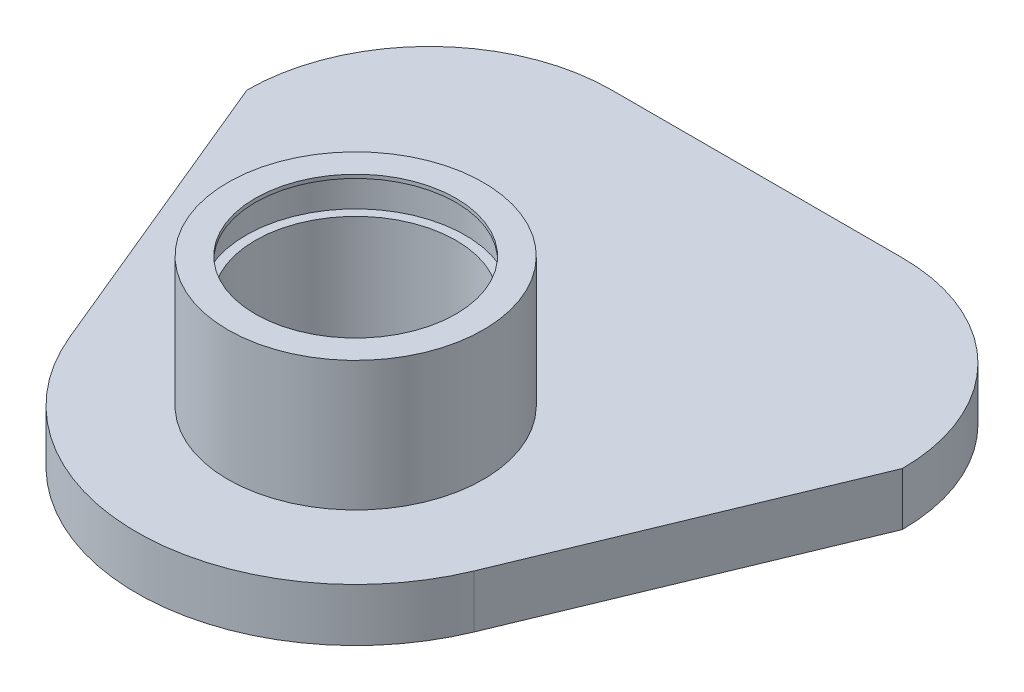
ISO-10303-21;
HEADER;
FILE_DESCRIPTION(('STEP AP214'),'2;1');
FILE_NAME('part.step','',(''),(''),'','','');
FILE_SCHEMA(('AUTOMOTIVE_DESIGN { 1 0 10303 214 1 1 1 1 }'));
ENDSEC;
DATA;
#1=APPLICATION_CONTEXT('core data for automotive mechanical design processes');
#2=APPLICATION_PROTOCOL_DEFINITION('international standard','automotive_design',2000,#1);
#3=PRODUCT_CONTEXT('',#1,'mechanical');
#4=PRODUCT('Part','Part','',(#3));
#5=PRODUCT_RELATED_PRODUCT_CATEGORY('part','',(#4));
#6=PRODUCT_DEFINITION_FORMATION('','',#4);
#7=PRODUCT_DEFINITION_CONTEXT('part definition',#1,'design');
#8=PRODUCT_DEFINITION('design','',#6,#7);
#9=PRODUCT_DEFINITION_SHAPE('','',#8);
#10=(LENGTH_UNIT() NAMED_UNIT(*) SI_UNIT(.MILLI.,.METRE.));
#11=(NAMED_UNIT(*) PLANE_ANGLE_UNIT() SI_UNIT($,.RADIAN.));
#12=(NAMED_UNIT(*) SI_UNIT($,.STERADIAN.) SOLID_ANGLE_UNIT());
#13=UNCERTAINTY_MEASURE_WITH_UNIT(LENGTH_MEASURE(1.E-05),#10,'distance_accuracy_value','');
#14=(GEOMETRIC_REPRESENTATION_CONTEXT(3) GLOBAL_UNCERTAINTY_ASSIGNED_CONTEXT((#13)) GLOBAL_UNIT_ASSIGNED_CONTEXT((#10,
#11,#12)) REPRESENTATION_CONTEXT('',''));
#15=CARTESIAN_POINT('',(0.,0.,0.));
#16=DIRECTION('',(0.,0.,1.));
#17=DIRECTION('',(1.,0.,0.));
#18=AXIS2_PLACEMENT_3D('',#15,#16,#17);
#19=CARTESIAN_POINT('',(0.,2.9,0.));
#20=DIRECTION('',(0.,-1.,0.));
#21=DIRECTION('',(0.,0.,-1.));
#22=AXIS2_PLACEMENT_3D('',#19,#20,#21);
#23=CYLINDRICAL_SURFACE('',#22,12.);
#24=CARTESIAN_POINT('',(0.,0.,0.));
#25=DIRECTION('',(0.,1.,0.));
#26=DIRECTION('',(0.,0.,1.));
#27=AXIS2_PLACEMENT_3D('',#24,#25,#26);
#28=CIRCLE('',#27,12.);
#29=CARTESIAN_POINT('',(-11.0865543901354,0.,4.59220118838109));
#30=VERTEX_POINT('',#29);
#31=CARTESIAN_POINT('',(11.0865543901354,0.,4.59220118838109));
#32=VERTEX_POINT('',#31);
#33=EDGE_CURVE('E135',#30,#32,#28,.T.);
#34=ORIENTED_EDGE('',*,*,#33,.T.);
#35=DIRECTION('',(0.,-1.,0.));
#36=VECTOR('',#35,1.);
#37=CARTESIAN_POINT('',(11.0865543901354,2.9,4.59220118838109));
#38=LINE('',#37,#36);
#39=CARTESIAN_POINT('',(11.0865543901354,2.9,4.59220118838109));
#40=VERTEX_POINT('',#39);
#41=EDGE_CURVE('E11',#40,#32,#38,.T.);
#42=ORIENTED_EDGE('',*,*,#41,.F.);
#43=CARTESIAN_POINT('',(0.,2.9,0.));
#44=DIRECTION('',(0.,1.,0.));
#45=DIRECTION('',(0.,0.,1.));
#46=AXIS2_PLACEMENT_3D('',#43,#44,#45);
#47=CIRCLE('',#46,12.);
#48=CARTESIAN_POINT('',(-11.0865543901354,2.9,4.59220118838109));
#49=VERTEX_POINT('',#48);
#50=EDGE_CURVE('E153',#49,#40,#47,.T.);
#51=ORIENTED_EDGE('',*,*,#50,.F.);
#52=DIRECTION('',(0.,-1.,0.));
#53=VECTOR('',#52,1.);
#54=CARTESIAN_POINT('',(-11.0865543901354,2.9,4.59220118838109));
#55=LINE('',#54,#53);
#56=EDGE_CURVE('E55',#49,#30,#55,.T.);
#57=ORIENTED_EDGE('',*,*,#56,.T.);
#58=EDGE_LOOP('',(#34,#42,#51,#57));
#59=FACE_BOUND('',#58,.T.);
#60=ADVANCED_FACE('F39',(#59),#23,.T.);
#61=CARTESIAN_POINT('',(11.0865543901354,2.9,4.59220118838109));
#62=DIRECTION('',(-0.923879532511286,0.,-0.382683432365091));
#63=DIRECTION('',(-0.382683432365091,0.,0.923879532511287));
#64=AXIS2_PLACEMENT_3D('',#61,#62,#63);
#65=PLANE('',#64);
#66=DIRECTION('',(0.382683432365091,0.,-0.923879532511287));
#67=VECTOR('',#66,1.);
#68=CARTESIAN_POINT('',(11.0865543901354,0.,4.59220118838109));
#69=LINE('',#68,#67);
#70=CARTESIAN_POINT('',(17.9592691519859,0.,-12.));
#71=VERTEX_POINT('',#70);
#72=EDGE_CURVE('E137',#32,#71,#69,.T.);
#73=ORIENTED_EDGE('',*,*,#72,.T.);
#74=DIRECTION('',(0.,-1.,0.));
#75=VECTOR('',#74,1.);
#76=CARTESIAN_POINT('',(17.9592691519859,2.9,-12.));
#77=LINE('',#76,#75);
#78=CARTESIAN_POINT('',(17.9592691519859,2.9,-12.));
#79=VERTEX_POINT('',#78);
#80=EDGE_CURVE('E47',#79,#71,#77,.T.);
#81=ORIENTED_EDGE('',*,*,#80,.F.);
#82=DIRECTION('',(0.382683432365091,0.,-0.923879532511287));
#83=VECTOR('',#82,1.);
#84=CARTESIAN_POINT('',(11.0865543901354,2.9,4.59220118838109));
#85=LINE('',#84,#83);
#86=EDGE_CURVE('E93',#40,#79,#85,.T.);
#87=ORIENTED_EDGE('',*,*,#86,.F.);
#88=ORIENTED_EDGE('',*,*,#41,.T.);
#89=EDGE_LOOP('',(#73,#81,#87,#88));
#90=FACE_BOUND('',#89,.T.);
#91=ADVANCED_FACE('F235',(#90),#65,.F.);
#92=CARTESIAN_POINT('',(17.9592691519859,2.9,0.));
#93=DIRECTION('',(-1.,0.,0.));
#94=DIRECTION('',(0.,0.,1.));
#95=AXIS2_PLACEMENT_3D('',#92,#93,#94);
#96=PLANE('',#95);
#97=DIRECTION('',(0.,0.,-1.));
#98=VECTOR('',#97,1.);
#99=CARTESIAN_POINT('',(17.9592691519859,0.,0.));
#100=LINE('',#99,#98);
#101=CARTESIAN_POINT('',(17.9592691519859,0.,-12.01));
#102=VERTEX_POINT('',#101);
#103=EDGE_CURVE('E140',#71,#102,#100,.T.);
#104=ORIENTED_EDGE('',*,*,#103,.T.);
#105=DIRECTION('',(0.,-1.,0.));
#106=VECTOR('',#105,1.);
#107=CARTESIAN_POINT('',(17.9592691519859,2.9,-12.01));
#108=LINE('',#107,#106);
#109=CARTESIAN_POINT('',(17.9592691519859,2.9,-12.01));
#110=VERTEX_POINT('',#109);
#111=EDGE_CURVE('E160',#110,#102,#108,.T.);
#112=ORIENTED_EDGE('',*,*,#111,.F.);
#113=DIRECTION('',(0.,0.,-1.));
#114=VECTOR('',#113,1.);
#115=CARTESIAN_POINT('',(17.9592691519859,2.9,0.));
#116=LINE('',#115,#114);
#117=EDGE_CURVE('E168',#79,#110,#116,.T.);
#118=ORIENTED_EDGE('',*,*,#117,.F.);
#119=ORIENTED_EDGE('',*,*,#80,.T.);
#120=EDGE_LOOP('',(#104,#112,#118,#119));
#121=FACE_BOUND('',#120,.T.);
#122=ADVANCED_FACE('F166',(#121),#96,.F.);
#123=CARTESIAN_POINT('',(7.96926915198588,2.9,-12.01));
#124=DIRECTION('',(0.,-1.,0.));
#125=DIRECTION('',(0.,0.,-1.));
#126=AXIS2_PLACEMENT_3D('',#123,#124,#125);
#127=CYLINDRICAL_SURFACE('',#126,9.99);
#128=CARTESIAN_POINT('',(7.96926915198588,0.,-12.01));
#129=DIRECTION('',(0.,1.,0.));
#130=DIRECTION('',(0.,0.,1.));
#131=AXIS2_PLACEMENT_3D('',#128,#129,#130);
#132=CIRCLE('',#131,9.99);
#133=CARTESIAN_POINT('',(7.96926915198588,0.,-22.));
#134=VERTEX_POINT('',#133);
#135=EDGE_CURVE('E142',#102,#134,#132,.T.);
#136=ORIENTED_EDGE('',*,*,#135,.T.);
#137=DIRECTION('',(0.,-1.,0.));
#138=VECTOR('',#137,1.);
#139=CARTESIAN_POINT('',(7.96926915198588,2.9,-22.));
#140=LINE('',#139,#138);
#141=CARTESIAN_POINT('',(7.96926915198588,2.9,-22.));
#142=VERTEX_POINT('',#141);
#143=EDGE_CURVE('E157',#142,#134,#140,.T.);
#144=ORIENTED_EDGE('',*,*,#143,.F.);
#145=CARTESIAN_POINT('',(7.96926915198588,2.9,-12.01));
#146=DIRECTION('',(0.,1.,0.));
#147=DIRECTION('',(0.,0.,1.));
#148=AXIS2_PLACEMENT_3D('',#145,#146,#147);
#149=CIRCLE('',#148,9.99);
#150=EDGE_CURVE('E179',#110,#142,#149,.T.);
#151=ORIENTED_EDGE('',*,*,#150,.F.);
#152=ORIENTED_EDGE('',*,*,#111,.T.);
#153=EDGE_LOOP('',(#136,#144,#151,#152));
#154=FACE_BOUND('',#153,.T.);
#155=ADVANCED_FACE('F175',(#154),#127,.T.);
#156=CARTESIAN_POINT('',(0.,2.9,-22.));
#157=DIRECTION('',(0.,0.,1.));
#158=DIRECTION('',(1.,0.,0.));
#159=AXIS2_PLACEMENT_3D('',#156,#157,#158);
#160=PLANE('',#159);
#161=DIRECTION('',(-1.,0.,0.));
#162=VECTOR('',#161,1.);
#163=CARTESIAN_POINT('',(0.,0.,-22.));
#164=LINE('',#163,#162);
#165=CARTESIAN_POINT('',(-7.96926915198588,0.,-22.));
#166=VERTEX_POINT('',#165);
#167=EDGE_CURVE('E144',#134,#166,#164,.T.);
#168=ORIENTED_EDGE('',*,*,#167,.T.);
#169=DIRECTION('',(0.,-1.,0.));
#170=VECTOR('',#169,1.);
#171=CARTESIAN_POINT('',(-7.96926915198588,2.9,-22.));
#172=LINE('',#171,#170);
#173=CARTESIAN_POINT('',(-7.96926915198588,2.9,-22.));
#174=VERTEX_POINT('',#173);
#175=EDGE_CURVE('E118',#174,#166,#172,.T.);
#176=ORIENTED_EDGE('',*,*,#175,.F.);
#177=DIRECTION('',(-1.,0.,0.));
#178=VECTOR('',#177,1.);
#179=CARTESIAN_POINT('',(0.,2.9,-22.));
#180=LINE('',#179,#178);
#181=EDGE_CURVE('E126',#142,#174,#180,.T.);
#182=ORIENTED_EDGE('',*,*,#181,.F.);
#183=ORIENTED_EDGE('',*,*,#143,.T.);
#184=EDGE_LOOP('',(#168,#176,#182,#183));
#185=FACE_BOUND('',#184,.T.);
#186=ADVANCED_FACE('F178',(#185),#160,.F.);
#187=CARTESIAN_POINT('',(-7.96926915198588,2.9,-12.01));
#188=DIRECTION('',(0.,-1.,0.));
#189=DIRECTION('',(0.,0.,-1.));
#190=AXIS2_PLACEMENT_3D('',#187,#188,#189);
#191=CYLINDRICAL_SURFACE('',#190,9.99);
#192=CARTESIAN_POINT('',(-7.96926915198588,0.,-12.01));
#193=DIRECTION('',(0.,1.,0.));
#194=DIRECTION('',(0.,0.,1.));
#195=AXIS2_PLACEMENT_3D('',#192,#193,#194);
#196=CIRCLE('',#195,9.99);
#197=CARTESIAN_POINT('',(-17.9592691519859,0.,-12.01));
#198=VERTEX_POINT('',#197);
#199=EDGE_CURVE('E114',#198,#166,#196,.F.);
#200=ORIENTED_EDGE('',*,*,#199,.F.);
#201=DIRECTION('',(0.,-1.,0.));
#202=VECTOR('',#201,1.);
#203=CARTESIAN_POINT('',(-17.9592691519859,2.9,-12.01));
#204=LINE('',#203,#202);
#205=CARTESIAN_POINT('',(-17.9592691519859,2.9,-12.01));
#206=VERTEX_POINT('',#205);
#207=EDGE_CURVE('E109',#206,#198,#204,.T.);
#208=ORIENTED_EDGE('',*,*,#207,.F.);
#209=CARTESIAN_POINT('',(-7.96926915198588,2.9,-12.01));
#210=DIRECTION('',(0.,1.,0.));
#211=DIRECTION('',(0.,0.,1.));
#212=AXIS2_PLACEMENT_3D('',#209,#210,#211);
#213=CIRCLE('',#212,9.99);
#214=EDGE_CURVE('E112',#206,#174,#213,.F.);
#215=ORIENTED_EDGE('',*,*,#214,.T.);
#216=ORIENTED_EDGE('',*,*,#175,.T.);
#217=EDGE_LOOP('',(#200,#208,#215,#216));
#218=FACE_BOUND('',#217,.T.);
#219=ADVANCED_FACE('F111',(#218),#191,.T.);
#220=CARTESIAN_POINT('',(-17.9592691519859,2.9,0.));
#221=DIRECTION('',(-1.,0.,0.));
#222=DIRECTION('',(0.,0.,1.));
#223=AXIS2_PLACEMENT_3D('',#220,#221,#222);
#224=PLANE('',#223);
#225=DIRECTION('',(0.,0.,-1.));
#226=VECTOR('',#225,1.);
#227=CARTESIAN_POINT('',(-17.9592691519859,0.,0.));
#228=LINE('',#227,#226);
#229=CARTESIAN_POINT('',(-17.9592691519859,0.,-12.));
#230=VERTEX_POINT('',#229);
#231=EDGE_CURVE('E148',#230,#198,#228,.T.);
#232=ORIENTED_EDGE('',*,*,#231,.F.);
#233=DIRECTION('',(0.,-1.,0.));
#234=VECTOR('',#233,1.);
#235=CARTESIAN_POINT('',(-17.9592691519859,2.9,-12.));
#236=LINE('',#235,#234);
#237=CARTESIAN_POINT('',(-17.9592691519859,2.9,-12.));
#238=VERTEX_POINT('',#237);
#239=EDGE_CURVE('E81',#238,#230,#236,.T.);
#240=ORIENTED_EDGE('',*,*,#239,.F.);
#241=DIRECTION('',(0.,0.,-1.));
#242=VECTOR('',#241,1.);
#243=CARTESIAN_POINT('',(-17.9592691519859,2.9,0.));
#244=LINE('',#243,#242);
#245=EDGE_CURVE('E124',#238,#206,#244,.T.);
#246=ORIENTED_EDGE('',*,*,#245,.T.);
#247=ORIENTED_EDGE('',*,*,#207,.T.);
#248=EDGE_LOOP('',(#232,#240,#246,#247));
#249=FACE_BOUND('',#248,.T.);
#250=ADVANCED_FACE('F129',(#249),#224,.T.);
#251=CARTESIAN_POINT('',(-11.0865543901354,2.9,4.59220118838109));
#252=DIRECTION('',(-0.923879532511287,0.,0.382683432365091));
#253=DIRECTION('',(0.382683432365091,0.,0.923879532511287));
#254=AXIS2_PLACEMENT_3D('',#251,#252,#253);
#255=PLANE('',#254);
#256=DIRECTION('',(-0.382683432365091,0.,-0.923879532511287));
#257=VECTOR('',#256,1.);
#258=CARTESIAN_POINT('',(-11.0865543901354,0.,4.59220118838109));
#259=LINE('',#258,#257);
#260=EDGE_CURVE('E150',#30,#230,#259,.T.);
#261=ORIENTED_EDGE('',*,*,#260,.F.);
#262=ORIENTED_EDGE('',*,*,#56,.F.);
#263=DIRECTION('',(-0.382683432365091,0.,-0.923879532511287));
#264=VECTOR('',#263,1.);
#265=CARTESIAN_POINT('',(-11.0865543901354,2.9,4.59220118838109));
#266=LINE('',#265,#264);
#267=EDGE_CURVE('E130',#49,#238,#266,.T.);
#268=ORIENTED_EDGE('',*,*,#267,.T.);
#269=ORIENTED_EDGE('',*,*,#239,.T.);
#270=EDGE_LOOP('',(#261,#262,#268,#269));
#271=FACE_BOUND('',#270,.T.);
#272=ADVANCED_FACE('F240',(#271),#255,.T.);
#273=CARTESIAN_POINT('',(0.,2.9,0.));
#274=DIRECTION('',(0.,1.,0.));
#275=DIRECTION('',(0.,0.,1.));
#276=AXIS2_PLACEMENT_3D('',#273,#274,#275);
#277=PLANE('',#276);
#278=CARTESIAN_POINT('',(0.,2.9,0.));
#279=DIRECTION('',(0.,1.,0.));
#280=DIRECTION('',(0.,0.,1.));
#281=AXIS2_PLACEMENT_3D('',#278,#279,#280);
#282=CIRCLE('',#281,7.);
#283=CARTESIAN_POINT('',(0.,2.9,7.));
#284=VERTEX_POINT('',#283);
#285=EDGE_CURVE('E138',#284,#284,#282,.F.);
#286=ORIENTED_EDGE('',*,*,#285,.T.);
#287=EDGE_LOOP('',(#286));
#288=FACE_BOUND('',#287,.T.);
#289=ORIENTED_EDGE('',*,*,#50,.T.);
#290=ORIENTED_EDGE('',*,*,#86,.T.);
#291=ORIENTED_EDGE('',*,*,#117,.T.);
#292=ORIENTED_EDGE('',*,*,#150,.T.);
#293=ORIENTED_EDGE('',*,*,#181,.T.);
#294=ORIENTED_EDGE('',*,*,#214,.F.);
#295=ORIENTED_EDGE('',*,*,#245,.F.);
#296=ORIENTED_EDGE('',*,*,#267,.F.);
#297=EDGE_LOOP('',(#289,#290,#291,#292,#293,#294,#295,#296));
#298=FACE_BOUND('',#297,.T.);
#299=ADVANCED_FACE('F122',(#288,#298),#277,.T.);
#300=CARTESIAN_POINT('',(0.,0.,0.));
#301=DIRECTION('',(0.,1.,0.));
#302=DIRECTION('',(0.,0.,1.));
#303=AXIS2_PLACEMENT_3D('',#300,#301,#302);
#304=PLANE('',#303);
#305=ORIENTED_EDGE('',*,*,#33,.F.);
#306=ORIENTED_EDGE('',*,*,#260,.T.);
#307=ORIENTED_EDGE('',*,*,#231,.T.);
#308=ORIENTED_EDGE('',*,*,#199,.T.);
#309=ORIENTED_EDGE('',*,*,#167,.F.);
#310=ORIENTED_EDGE('',*,*,#135,.F.);
#311=ORIENTED_EDGE('',*,*,#103,.F.);
#312=ORIENTED_EDGE('',*,*,#72,.F.);
#313=EDGE_LOOP('',(#305,#306,#307,#308,#309,#310,#311,#312));
#314=FACE_BOUND('',#313,.T.);
#315=ADVANCED_FACE('F171',(#314),#304,.F.);
#316=CARTESIAN_POINT('',(0.,10.,0.));
#317=DIRECTION('',(0.,-1.,0.));
#318=DIRECTION('',(0.,0.,-1.));
#319=AXIS2_PLACEMENT_3D('',#316,#317,#318);
#320=CYLINDRICAL_SURFACE('',#319,7.);
#321=ORIENTED_EDGE('',*,*,#285,.F.);
#322=EDGE_LOOP('',(#321));
#323=FACE_BOUND('',#322,.T.);
#324=CARTESIAN_POINT('',(0.,10.,0.));
#325=DIRECTION('',(0.,1.,0.));
#326=DIRECTION('',(0.,0.,1.));
#327=AXIS2_PLACEMENT_3D('',#324,#325,#326);
#328=CIRCLE('',#327,7.);
#329=CARTESIAN_POINT('',(0.,10.,7.));
#330=VERTEX_POINT('',#329);
#331=EDGE_CURVE('E187',#330,#330,#328,.T.);
#332=ORIENTED_EDGE('',*,*,#331,.F.);
#333=EDGE_LOOP('',(#332));
#334=FACE_BOUND('',#333,.T.);
#335=ADVANCED_FACE('F302',(#323,#334),#320,.T.);
#336=CARTESIAN_POINT('',(0.,10.,0.));
#337=DIRECTION('',(0.,1.,0.));
#338=DIRECTION('',(0.,0.,1.));
#339=AXIS2_PLACEMENT_3D('',#336,#337,#338);
#340=PLANE('',#339);
#341=CARTESIAN_POINT('',(0.,10.,0.));
#342=DIRECTION('',(0.,1.,0.));
#343=DIRECTION('',(0.,0.,1.));
#344=AXIS2_PLACEMENT_3D('',#341,#342,#343);
#345=CIRCLE('',#344,5.5);
#346=CARTESIAN_POINT('',(0.,10.,5.5));
#347=VERTEX_POINT('',#346);
#348=EDGE_CURVE('E191',#347,#347,#345,.T.);
#349=ORIENTED_EDGE('',*,*,#348,.F.);
#350=EDGE_LOOP('',(#349));
#351=FACE_BOUND('',#350,.T.);
#352=ORIENTED_EDGE('',*,*,#331,.T.);
#353=EDGE_LOOP('',(#352));
#354=FACE_BOUND('',#353,.T.);
#355=ADVANCED_FACE('F310',(#351,#354),#340,.T.);
#356=CARTESIAN_POINT('',(0.,2.,0.));
#357=DIRECTION('',(0.,1.,0.));
#358=DIRECTION('',(0.,0.,1.));
#359=AXIS2_PLACEMENT_3D('',#356,#357,#358);
#360=CYLINDRICAL_SURFACE('',#359,5.5);
#361=CARTESIAN_POINT('',(0.,9.8,0.));
#362=DIRECTION('',(0.,1.,0.));
#363=DIRECTION('',(0.,0.,1.));
#364=AXIS2_PLACEMENT_3D('',#361,#362,#363);
#365=CIRCLE('',#364,5.5);
#366=CARTESIAN_POINT('',(0.,9.8,5.5));
#367=VERTEX_POINT('',#366);
#368=EDGE_CURVE('E203',#367,#367,#365,.T.);
#369=ORIENTED_EDGE('',*,*,#368,.F.);
#370=EDGE_LOOP('',(#369));
#371=FACE_BOUND('',#370,.T.);
#372=ORIENTED_EDGE('',*,*,#348,.T.);
#373=EDGE_LOOP('',(#372));
#374=FACE_BOUND('',#373,.T.);
#375=ADVANCED_FACE('F221',(#371,#374),#360,.F.);
#376=CARTESIAN_POINT('',(0.,8.,0.));
#377=DIRECTION('',(0.,1.,0.));
#378=DIRECTION('',(0.,0.,1.));
#379=AXIS2_PLACEMENT_3D('',#376,#377,#378);
#380=CYLINDRICAL_SURFACE('',#379,6.);
#381=CARTESIAN_POINT('',(0.,8.,0.));
#382=DIRECTION('',(0.,1.,0.));
#383=DIRECTION('',(0.,0.,1.));
#384=AXIS2_PLACEMENT_3D('',#381,#382,#383);
#385=CIRCLE('',#384,6.);
#386=CARTESIAN_POINT('',(0.,8.,6.));
#387=VERTEX_POINT('',#386);
#388=EDGE_CURVE('E194',#387,#387,#385,.T.);
#389=ORIENTED_EDGE('',*,*,#388,.F.);
#390=EDGE_LOOP('',(#389));
#391=FACE_BOUND('',#390,.T.);
#392=CARTESIAN_POINT('',(0.,9.8,0.));
#393=DIRECTION('',(0.,1.,0.));
#394=DIRECTION('',(0.,0.,1.));
#395=AXIS2_PLACEMENT_3D('',#392,#393,#394);
#396=CIRCLE('',#395,6.);
#397=CARTESIAN_POINT('',(0.,9.8,6.));
#398=VERTEX_POINT('',#397);
#399=EDGE_CURVE('E197',#398,#398,#396,.T.);
#400=ORIENTED_EDGE('',*,*,#399,.T.);
#401=EDGE_LOOP('',(#400));
#402=FACE_BOUND('',#401,.T.);
#403=ADVANCED_FACE('F215',(#391,#402),#380,.F.);
#404=CARTESIAN_POINT('',(0.,8.,0.));
#405=DIRECTION('',(0.,1.,0.));
#406=DIRECTION('',(0.,0.,1.));
#407=AXIS2_PLACEMENT_3D('',#404,#405,#406);
#408=PLANE('',#407);
#409=CARTESIAN_POINT('',(0.,8.,0.));
#410=DIRECTION('',(0.,1.,0.));
#411=DIRECTION('',(0.,0.,1.));
#412=AXIS2_PLACEMENT_3D('',#409,#410,#411);
#413=CIRCLE('',#412,5.5);
#414=CARTESIAN_POINT('',(0.,8.,5.5));
#415=VERTEX_POINT('',#414);
#416=EDGE_CURVE('E200',#415,#415,#413,.T.);
#417=ORIENTED_EDGE('',*,*,#416,.F.);
#418=EDGE_LOOP('',(#417));
#419=FACE_BOUND('',#418,.T.);
#420=ORIENTED_EDGE('',*,*,#388,.T.);
#421=EDGE_LOOP('',(#420));
#422=FACE_BOUND('',#421,.T.);
#423=ADVANCED_FACE('F211',(#419,#422),#408,.T.);
#424=CARTESIAN_POINT('',(0.,9.8,0.));
#425=DIRECTION('',(0.,1.,0.));
#426=DIRECTION('',(0.,0.,1.));
#427=AXIS2_PLACEMENT_3D('',#424,#425,#426);
#428=PLANE('',#427);
#429=ORIENTED_EDGE('',*,*,#368,.T.);
#430=EDGE_LOOP('',(#429));
#431=FACE_BOUND('',#430,.T.);
#432=ORIENTED_EDGE('',*,*,#399,.F.);
#433=EDGE_LOOP('',(#432));
#434=FACE_BOUND('',#433,.T.);
#435=ADVANCED_FACE('F214',(#431,#434),#428,.F.);
#436=CARTESIAN_POINT('',(0.,2.,0.));
#437=DIRECTION('',(0.,1.,0.));
#438=DIRECTION('',(0.,0.,1.));
#439=AXIS2_PLACEMENT_3D('',#436,#437,#438);
#440=PLANE('',#439);
#441=CARTESIAN_POINT('',(0.,2.,0.));
#442=DIRECTION('',(0.,1.,0.));
#443=DIRECTION('',(0.,0.,1.));
#444=AXIS2_PLACEMENT_3D('',#441,#442,#443);
#445=CIRCLE('',#444,5.5);
#446=CARTESIAN_POINT('',(0.,2.,5.5));
#447=VERTEX_POINT('',#446);
#448=EDGE_CURVE('E190',#447,#447,#445,.T.);
#449=ORIENTED_EDGE('',*,*,#448,.T.);
#450=EDGE_LOOP('',(#449));
#451=FACE_BOUND('',#450,.T.);
#452=ADVANCED_FACE('F226',(#451),#440,.T.);
#453=ORIENTED_EDGE('',*,*,#448,.F.);
#454=EDGE_LOOP('',(#453));
#455=FACE_BOUND('',#454,.T.);
#456=ORIENTED_EDGE('',*,*,#416,.T.);
#457=EDGE_LOOP('',(#456));
#458=FACE_BOUND('',#457,.T.);
#459=ADVANCED_FACE('F209',(#455,#458),#360,.F.);
#460=CLOSED_SHELL('',(#60,#91,#122,#155,#186,#219,#250,#272,#299,#315,#335,#355,#375,#403,#423,
#435,#452,#459));
#461=MANIFOLD_SOLID_BREP('B2',#460);
#462=ADVANCED_BREP_SHAPE_REPRESENTATION('',(#18,#461),#14);
#463=SHAPE_DEFINITION_REPRESENTATION(#9,#462);
ENDSEC;
END-ISO-10303-21;
